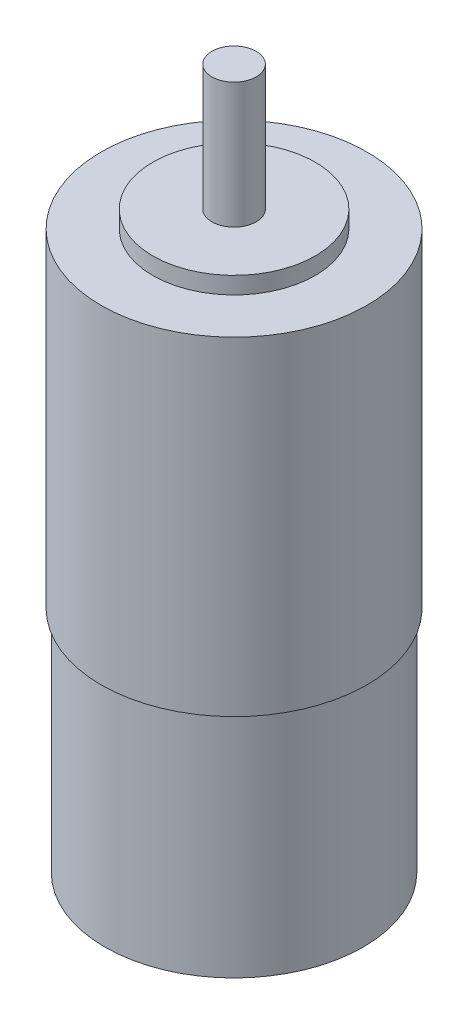
ISO-10303-21;
HEADER;
FILE_DESCRIPTION(('STEP AP214'),'2;1');
FILE_NAME('part.step','',(''),(''),'','','');
FILE_SCHEMA(('AUTOMOTIVE_DESIGN { 1 0 10303 214 1 1 1 1 }'));
ENDSEC;
DATA;
#1=APPLICATION_CONTEXT('core data for automotive mechanical design processes');
#2=APPLICATION_PROTOCOL_DEFINITION('international standard','automotive_design',2000,#1);
#3=PRODUCT_CONTEXT('',#1,'mechanical');
#4=PRODUCT('Part','Part','',(#3));
#5=PRODUCT_RELATED_PRODUCT_CATEGORY('part','',(#4));
#6=PRODUCT_DEFINITION_FORMATION('','',#4);
#7=PRODUCT_DEFINITION_CONTEXT('part definition',#1,'design');
#8=PRODUCT_DEFINITION('design','',#6,#7);
#9=PRODUCT_DEFINITION_SHAPE('','',#8);
#10=(LENGTH_UNIT() NAMED_UNIT(*) SI_UNIT(.MILLI.,.METRE.));
#11=(NAMED_UNIT(*) PLANE_ANGLE_UNIT() SI_UNIT($,.RADIAN.));
#12=(NAMED_UNIT(*) SI_UNIT($,.STERADIAN.) SOLID_ANGLE_UNIT());
#13=UNCERTAINTY_MEASURE_WITH_UNIT(LENGTH_MEASURE(1.E-05),#10,'distance_accuracy_value','');
#14=(GEOMETRIC_REPRESENTATION_CONTEXT(3) GLOBAL_UNCERTAINTY_ASSIGNED_CONTEXT((#13)) GLOBAL_UNIT_ASSIGNED_CONTEXT((#10,
#11,#12)) REPRESENTATION_CONTEXT('',''));
#15=CARTESIAN_POINT('',(0.,0.,0.));
#16=DIRECTION('',(0.,0.,1.));
#17=DIRECTION('',(1.,0.,0.));
#18=AXIS2_PLACEMENT_3D('',#15,#16,#17);
#19=CARTESIAN_POINT('',(0.,31.,0.));
#20=DIRECTION('',(0.,-1.,0.));
#21=DIRECTION('',(0.,0.,-1.));
#22=AXIS2_PLACEMENT_3D('',#19,#20,#21);
#23=CYLINDRICAL_SURFACE('',#22,17.5);
#24=CARTESIAN_POINT('',(0.,31.,0.));
#25=DIRECTION('',(0.,1.,0.));
#26=DIRECTION('',(0.,0.,1.));
#27=AXIS2_PLACEMENT_3D('',#24,#25,#26);
#28=CIRCLE('',#27,17.5);
#29=CARTESIAN_POINT('',(0.,31.,17.5));
#30=VERTEX_POINT('',#29);
#31=EDGE_CURVE('E51',#30,#30,#28,.T.);
#32=ORIENTED_EDGE('',*,*,#31,.F.);
#33=EDGE_LOOP('',(#32));
#34=FACE_BOUND('',#33,.T.);
#35=CARTESIAN_POINT('',(0.,0.,0.));
#36=DIRECTION('',(0.,1.,0.));
#37=DIRECTION('',(0.,0.,1.));
#38=AXIS2_PLACEMENT_3D('',#35,#36,#37);
#39=CIRCLE('',#38,17.5);
#40=CARTESIAN_POINT('',(0.,0.,17.5));
#41=VERTEX_POINT('',#40);
#42=EDGE_CURVE('E40',#41,#41,#39,.T.);
#43=ORIENTED_EDGE('',*,*,#42,.T.);
#44=EDGE_LOOP('',(#43));
#45=FACE_BOUND('',#44,.T.);
#46=ADVANCED_FACE('F37',(#34,#45),#23,.T.);
#47=CARTESIAN_POINT('',(0.,0.,0.));
#48=DIRECTION('',(0.,1.,0.));
#49=DIRECTION('',(0.,0.,1.));
#50=AXIS2_PLACEMENT_3D('',#47,#48,#49);
#51=PLANE('',#50);
#52=ORIENTED_EDGE('',*,*,#42,.F.);
#53=EDGE_LOOP('',(#52));
#54=FACE_BOUND('',#53,.T.);
#55=ADVANCED_FACE('F76',(#54),#51,.F.);
#56=CARTESIAN_POINT('',(0.,75.5,0.));
#57=DIRECTION('',(0.,-1.,0.));
#58=DIRECTION('',(0.,0.,-1.));
#59=AXIS2_PLACEMENT_3D('',#56,#57,#58);
#60=CYLINDRICAL_SURFACE('',#59,18.);
#61=CARTESIAN_POINT('',(0.,75.5,0.));
#62=DIRECTION('',(0.,1.,0.));
#63=DIRECTION('',(0.,0.,1.));
#64=AXIS2_PLACEMENT_3D('',#61,#62,#63);
#65=CIRCLE('',#64,18.);
#66=CARTESIAN_POINT('',(0.,75.5,18.));
#67=VERTEX_POINT('',#66);
#68=EDGE_CURVE('E61',#67,#67,#65,.T.);
#69=ORIENTED_EDGE('',*,*,#68,.F.);
#70=EDGE_LOOP('',(#69));
#71=FACE_BOUND('',#70,.T.);
#72=CARTESIAN_POINT('',(0.,31.,0.));
#73=DIRECTION('',(0.,1.,0.));
#74=DIRECTION('',(0.,0.,1.));
#75=AXIS2_PLACEMENT_3D('',#72,#73,#74);
#76=CIRCLE('',#75,18.);
#77=CARTESIAN_POINT('',(0.,31.,18.));
#78=VERTEX_POINT('',#77);
#79=EDGE_CURVE('E59',#78,#78,#76,.T.);
#80=ORIENTED_EDGE('',*,*,#79,.T.);
#81=EDGE_LOOP('',(#80));
#82=FACE_BOUND('',#81,.T.);
#83=ADVANCED_FACE('F78',(#71,#82),#60,.T.);
#84=CARTESIAN_POINT('',(0.,75.5,0.));
#85=DIRECTION('',(0.,1.,0.));
#86=DIRECTION('',(0.,0.,1.));
#87=AXIS2_PLACEMENT_3D('',#84,#85,#86);
#88=PLANE('',#87);
#89=CARTESIAN_POINT('',(0.,75.5,0.));
#90=DIRECTION('',(0.,1.,0.));
#91=DIRECTION('',(0.,0.,1.));
#92=AXIS2_PLACEMENT_3D('',#89,#90,#91);
#93=CIRCLE('',#92,11.);
#94=CARTESIAN_POINT('',(0.,75.5,11.));
#95=VERTEX_POINT('',#94);
#96=EDGE_CURVE('E45',#95,#95,#93,.T.);
#97=ORIENTED_EDGE('',*,*,#96,.F.);
#98=EDGE_LOOP('',(#97));
#99=FACE_BOUND('',#98,.T.);
#100=ORIENTED_EDGE('',*,*,#68,.T.);
#101=EDGE_LOOP('',(#100));
#102=FACE_BOUND('',#101,.T.);
#103=ADVANCED_FACE('F83',(#99,#102),#88,.T.);
#104=CARTESIAN_POINT('',(0.,31.,0.));
#105=DIRECTION('',(0.,1.,0.));
#106=DIRECTION('',(0.,0.,1.));
#107=AXIS2_PLACEMENT_3D('',#104,#105,#106);
#108=PLANE('',#107);
#109=ORIENTED_EDGE('',*,*,#31,.T.);
#110=EDGE_LOOP('',(#109));
#111=FACE_BOUND('',#110,.T.);
#112=ORIENTED_EDGE('',*,*,#79,.F.);
#113=EDGE_LOOP('',(#112));
#114=FACE_BOUND('',#113,.T.);
#115=ADVANCED_FACE('F88',(#111,#114),#108,.F.);
#116=CARTESIAN_POINT('',(0.,77.8,0.));
#117=DIRECTION('',(0.,-1.,0.));
#118=DIRECTION('',(0.,0.,-1.));
#119=AXIS2_PLACEMENT_3D('',#116,#117,#118);
#120=CYLINDRICAL_SURFACE('',#119,11.);
#121=CARTESIAN_POINT('',(0.,77.8,0.));
#122=DIRECTION('',(0.,1.,0.));
#123=DIRECTION('',(0.,0.,1.));
#124=AXIS2_PLACEMENT_3D('',#121,#122,#123);
#125=CIRCLE('',#124,11.);
#126=CARTESIAN_POINT('',(0.,77.8,11.));
#127=VERTEX_POINT('',#126);
#128=EDGE_CURVE('E56',#127,#127,#125,.T.);
#129=ORIENTED_EDGE('',*,*,#128,.F.);
#130=EDGE_LOOP('',(#129));
#131=FACE_BOUND('',#130,.T.);
#132=ORIENTED_EDGE('',*,*,#96,.T.);
#133=EDGE_LOOP('',(#132));
#134=FACE_BOUND('',#133,.T.);
#135=ADVANCED_FACE('F91',(#131,#134),#120,.T.);
#136=CARTESIAN_POINT('',(0.,77.8,0.));
#137=DIRECTION('',(0.,1.,0.));
#138=DIRECTION('',(0.,0.,1.));
#139=AXIS2_PLACEMENT_3D('',#136,#137,#138);
#140=PLANE('',#139);
#141=CARTESIAN_POINT('',(0.,77.8,0.));
#142=DIRECTION('',(0.,1.,0.));
#143=DIRECTION('',(0.,0.,1.));
#144=AXIS2_PLACEMENT_3D('',#141,#142,#143);
#145=CIRCLE('',#144,3.);
#146=CARTESIAN_POINT('',(0.,77.8,3.));
#147=VERTEX_POINT('',#146);
#148=EDGE_CURVE('E10',#147,#147,#145,.T.);
#149=ORIENTED_EDGE('',*,*,#148,.F.);
#150=EDGE_LOOP('',(#149));
#151=FACE_BOUND('',#150,.T.);
#152=ORIENTED_EDGE('',*,*,#128,.T.);
#153=EDGE_LOOP('',(#152));
#154=FACE_BOUND('',#153,.T.);
#155=ADVANCED_FACE('F97',(#151,#154),#140,.T.);
#156=CARTESIAN_POINT('',(0.,94.8,0.));
#157=DIRECTION('',(0.,-1.,0.));
#158=DIRECTION('',(0.,0.,-1.));
#159=AXIS2_PLACEMENT_3D('',#156,#157,#158);
#160=CYLINDRICAL_SURFACE('',#159,3.);
#161=CARTESIAN_POINT('',(0.,94.8,0.));
#162=DIRECTION('',(0.,1.,0.));
#163=DIRECTION('',(0.,0.,1.));
#164=AXIS2_PLACEMENT_3D('',#161,#162,#163);
#165=CIRCLE('',#164,3.);
#166=CARTESIAN_POINT('',(0.,94.8,3.));
#167=VERTEX_POINT('',#166);
#168=EDGE_CURVE('E55',#167,#167,#165,.T.);
#169=ORIENTED_EDGE('',*,*,#168,.F.);
#170=EDGE_LOOP('',(#169));
#171=FACE_BOUND('',#170,.T.);
#172=ORIENTED_EDGE('',*,*,#148,.T.);
#173=EDGE_LOOP('',(#172));
#174=FACE_BOUND('',#173,.T.);
#175=ADVANCED_FACE('F101',(#171,#174),#160,.T.);
#176=CARTESIAN_POINT('',(0.,94.8,0.));
#177=DIRECTION('',(0.,1.,0.));
#178=DIRECTION('',(0.,0.,1.));
#179=AXIS2_PLACEMENT_3D('',#176,#177,#178);
#180=PLANE('',#179);
#181=ORIENTED_EDGE('',*,*,#168,.T.);
#182=EDGE_LOOP('',(#181));
#183=FACE_BOUND('',#182,.T.);
#184=ADVANCED_FACE('F105',(#183),#180,.T.);
#185=CLOSED_SHELL('',(#46,#55,#83,#103,#115,#135,#155,#175,#184));
#186=MANIFOLD_SOLID_BREP('B2',#185);
#187=ADVANCED_BREP_SHAPE_REPRESENTATION('',(#18,#186),#14);
#188=SHAPE_DEFINITION_REPRESENTATION(#9,#187);
ENDSEC;
END-ISO-10303-21;
